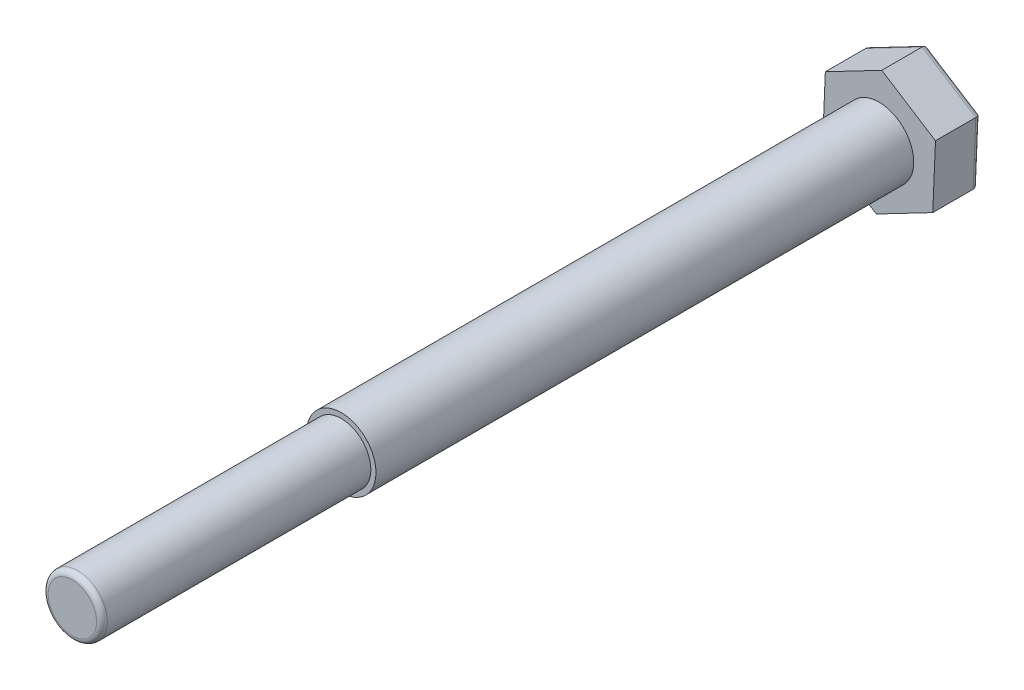
ISO-10303-21;
HEADER;
FILE_DESCRIPTION(('STEP AP214'),'2;1');
FILE_NAME('part.step','',(''),(''),'','','');
FILE_SCHEMA(('AUTOMOTIVE_DESIGN { 1 0 10303 214 1 1 1 1 }'));
ENDSEC;
DATA;
#1=APPLICATION_CONTEXT('core data for automotive mechanical design processes');
#2=APPLICATION_PROTOCOL_DEFINITION('international standard','automotive_design',2000,#1);
#3=PRODUCT_CONTEXT('',#1,'mechanical');
#4=PRODUCT('Part','Part','',(#3));
#5=PRODUCT_RELATED_PRODUCT_CATEGORY('part','',(#4));
#6=PRODUCT_DEFINITION_FORMATION('','',#4);
#7=PRODUCT_DEFINITION_CONTEXT('part definition',#1,'design');
#8=PRODUCT_DEFINITION('design','',#6,#7);
#9=PRODUCT_DEFINITION_SHAPE('','',#8);
#10=(LENGTH_UNIT() NAMED_UNIT(*) SI_UNIT(.MILLI.,.METRE.));
#11=(NAMED_UNIT(*) PLANE_ANGLE_UNIT() SI_UNIT($,.RADIAN.));
#12=(NAMED_UNIT(*) SI_UNIT($,.STERADIAN.) SOLID_ANGLE_UNIT());
#13=UNCERTAINTY_MEASURE_WITH_UNIT(LENGTH_MEASURE(1.E-05),#10,'distance_accuracy_value','');
#14=(GEOMETRIC_REPRESENTATION_CONTEXT(3) GLOBAL_UNCERTAINTY_ASSIGNED_CONTEXT((#13)) GLOBAL_UNIT_ASSIGNED_CONTEXT((#10,
#11,#12)) REPRESENTATION_CONTEXT('',''));
#15=CARTESIAN_POINT('',(0.,0.,0.));
#16=DIRECTION('',(0.,0.,1.));
#17=DIRECTION('',(1.,0.,0.));
#18=AXIS2_PLACEMENT_3D('',#15,#16,#17);
#19=CARTESIAN_POINT('',(19.9787997617734,-12.6957037383635,17.));
#20=DIRECTION('',(-0.999097599975706,0.0424733530909036,0.));
#21=DIRECTION('',(-0.0424733530909036,-0.999097599975706,0.));
#22=AXIS2_PLACEMENT_3D('',#19,#20,#21);
#23=PLANE('',#22);
#24=DIRECTION('',(0.,0.,-1.));
#25=VECTOR('',#24,1.);
#26=CARTESIAN_POINT('',(19.9787997617734,-12.6957037383635,17.));
#27=LINE('',#26,#25);
#28=CARTESIAN_POINT('',(19.9787997617734,-12.6957037383635,17.));
#29=VERTEX_POINT('',#28);
#30=CARTESIAN_POINT('',(19.9787997617734,-12.6957037383635,2.));
#31=VERTEX_POINT('',#30);
#32=EDGE_CURVE('E256',#29,#31,#27,.T.);
#33=ORIENTED_EDGE('',*,*,#32,.T.);
#34=DIRECTION('',(0.0424733530909036,0.999097599975706,0.));
#35=VECTOR('',#34,1.);
#36=CARTESIAN_POINT('',(20.9842018372306,10.9542962616365,2.));
#37=LINE('',#36,#35);
#38=CARTESIAN_POINT('',(20.9842018372306,10.9542962616365,2.));
#39=VERTEX_POINT('',#38);
#40=EDGE_CURVE('E131',#31,#39,#37,.T.);
#41=ORIENTED_EDGE('',*,*,#40,.T.);
#42=DIRECTION('',(0.,0.,-1.));
#43=VECTOR('',#42,1.);
#44=CARTESIAN_POINT('',(20.9842018372306,10.9542962616365,17.));
#45=LINE('',#44,#43);
#46=CARTESIAN_POINT('',(20.9842018372306,10.9542962616365,17.));
#47=VERTEX_POINT('',#46);
#48=EDGE_CURVE('E114',#47,#39,#45,.T.);
#49=ORIENTED_EDGE('',*,*,#48,.F.);
#50=DIRECTION('',(0.0424733530909036,0.999097599975706,0.));
#51=VECTOR('',#50,1.);
#52=CARTESIAN_POINT('',(19.9787997617734,-12.6957037383635,17.));
#53=LINE('',#52,#51);
#54=EDGE_CURVE('E121',#29,#47,#53,.T.);
#55=ORIENTED_EDGE('',*,*,#54,.F.);
#56=EDGE_LOOP('',(#33,#41,#49,#55));
#57=FACE_BOUND('',#56,.T.);
#58=ADVANCED_FACE('F35',(#57),#23,.F.);
#59=CARTESIAN_POINT('',(20.9842018372306,10.9542962616365,17.));
#60=DIRECTION('',(-0.536331802748482,-0.844007225893572,0.));
#61=DIRECTION('',(0.844007225893572,-0.536331802748482,0.));
#62=AXIS2_PLACEMENT_3D('',#59,#60,#61);
#63=PLANE('',#62);
#64=ORIENTED_EDGE('',*,*,#48,.T.);
#65=DIRECTION('',(-0.844007225893572,0.536331802748482,0.));
#66=VECTOR('',#65,1.);
#67=CARTESIAN_POINT('',(1.00540207545719,23.65,2.));
#68=LINE('',#67,#66);
#69=CARTESIAN_POINT('',(1.0054020754572,23.65,2.));
#70=VERTEX_POINT('',#69);
#71=EDGE_CURVE('E135',#39,#70,#68,.T.);
#72=ORIENTED_EDGE('',*,*,#71,.T.);
#73=DIRECTION('',(0.,0.,-1.));
#74=VECTOR('',#73,1.);
#75=CARTESIAN_POINT('',(1.0054020754572,23.65,17.));
#76=LINE('',#75,#74);
#77=CARTESIAN_POINT('',(1.0054020754572,23.65,17.));
#78=VERTEX_POINT('',#77);
#79=EDGE_CURVE('E117',#78,#70,#76,.T.);
#80=ORIENTED_EDGE('',*,*,#79,.F.);
#81=DIRECTION('',(-0.844007225893572,0.536331802748482,0.));
#82=VECTOR('',#81,1.);
#83=CARTESIAN_POINT('',(20.9842018372306,10.9542962616365,17.));
#84=LINE('',#83,#82);
#85=EDGE_CURVE('E109',#47,#78,#84,.T.);
#86=ORIENTED_EDGE('',*,*,#85,.F.);
#87=EDGE_LOOP('',(#64,#72,#80,#86));
#88=FACE_BOUND('',#87,.T.);
#89=ADVANCED_FACE('F111',(#88),#63,.F.);
#90=CARTESIAN_POINT('',(1.0054020754572,23.65,17.));
#91=DIRECTION('',(0.462765797227231,-0.886480578984472,0.));
#92=DIRECTION('',(0.886480578984472,0.462765797227231,0.));
#93=AXIS2_PLACEMENT_3D('',#90,#91,#92);
#94=PLANE('',#93);
#95=ORIENTED_EDGE('',*,*,#79,.T.);
#96=DIRECTION('',(-0.886480578984472,-0.462765797227231,0.));
#97=VECTOR('',#96,1.);
#98=CARTESIAN_POINT('',(-19.9787997617736,12.6957037383632,2.));
#99=LINE('',#98,#97);
#100=CARTESIAN_POINT('',(-19.9787997617736,12.6957037383632,2.));
#101=VERTEX_POINT('',#100);
#102=EDGE_CURVE('E155',#70,#101,#99,.T.);
#103=ORIENTED_EDGE('',*,*,#102,.T.);
#104=DIRECTION('',(0.,0.,-1.));
#105=VECTOR('',#104,1.);
#106=CARTESIAN_POINT('',(-19.9787997617736,12.6957037383632,17.));
#107=LINE('',#106,#105);
#108=CARTESIAN_POINT('',(-19.9787997617736,12.6957037383632,17.));
#109=VERTEX_POINT('',#108);
#110=EDGE_CURVE('E137',#109,#101,#107,.T.);
#111=ORIENTED_EDGE('',*,*,#110,.F.);
#112=DIRECTION('',(-0.886480578984472,-0.462765797227231,0.));
#113=VECTOR('',#112,1.);
#114=CARTESIAN_POINT('',(1.0054020754572,23.65,17.));
#115=LINE('',#114,#113);
#116=EDGE_CURVE('E120',#78,#109,#115,.T.);
#117=ORIENTED_EDGE('',*,*,#116,.F.);
#118=EDGE_LOOP('',(#95,#103,#111,#117));
#119=FACE_BOUND('',#118,.T.);
#120=ADVANCED_FACE('F196',(#119),#94,.F.);
#121=CARTESIAN_POINT('',(-19.9787997617736,12.6957037383632,17.));
#122=DIRECTION('',(0.999097599975706,-0.0424733530908878,0.));
#123=DIRECTION('',(0.0424733530908878,0.999097599975707,0.));
#124=AXIS2_PLACEMENT_3D('',#121,#122,#123);
#125=PLANE('',#124);
#126=ORIENTED_EDGE('',*,*,#110,.T.);
#127=DIRECTION('',(-0.0424733530908878,-0.999097599975707,0.));
#128=VECTOR('',#127,1.);
#129=CARTESIAN_POINT('',(-20.9842018372304,-10.9542962616368,2.));
#130=LINE('',#129,#128);
#131=CARTESIAN_POINT('',(-20.9842018372304,-10.9542962616368,2.));
#132=VERTEX_POINT('',#131);
#133=EDGE_CURVE('E157',#101,#132,#130,.T.);
#134=ORIENTED_EDGE('',*,*,#133,.T.);
#135=DIRECTION('',(0.,0.,-1.));
#136=VECTOR('',#135,1.);
#137=CARTESIAN_POINT('',(-20.9842018372304,-10.9542962616368,17.));
#138=LINE('',#137,#136);
#139=CARTESIAN_POINT('',(-20.9842018372304,-10.9542962616368,17.));
#140=VERTEX_POINT('',#139);
#141=EDGE_CURVE('E260',#140,#132,#138,.T.);
#142=ORIENTED_EDGE('',*,*,#141,.F.);
#143=DIRECTION('',(-0.0424733530908878,-0.999097599975706,0.));
#144=VECTOR('',#143,1.);
#145=CARTESIAN_POINT('',(-19.9787997617736,12.6957037383632,17.));
#146=LINE('',#145,#144);
#147=EDGE_CURVE('E249',#109,#140,#146,.T.);
#148=ORIENTED_EDGE('',*,*,#147,.F.);
#149=EDGE_LOOP('',(#126,#134,#142,#148));
#150=FACE_BOUND('',#149,.T.);
#151=ADVANCED_FACE('F262',(#150),#125,.F.);
#152=CARTESIAN_POINT('',(-20.9842018372304,-10.9542962616368,17.));
#153=DIRECTION('',(0.536331802748476,0.844007225893576,0.));
#154=DIRECTION('',(-0.844007225893576,0.536331802748476,0.));
#155=AXIS2_PLACEMENT_3D('',#152,#153,#154);
#156=PLANE('',#155);
#157=ORIENTED_EDGE('',*,*,#141,.T.);
#158=DIRECTION('',(0.844007225893576,-0.536331802748476,0.));
#159=VECTOR('',#158,1.);
#160=CARTESIAN_POINT('',(-1.00540207545719,-23.65,2.));
#161=LINE('',#160,#159);
#162=CARTESIAN_POINT('',(-1.00540207545719,-23.65,2.));
#163=VERTEX_POINT('',#162);
#164=EDGE_CURVE('E58',#132,#163,#161,.T.);
#165=ORIENTED_EDGE('',*,*,#164,.T.);
#166=DIRECTION('',(0.,0.,-1.));
#167=VECTOR('',#166,1.);
#168=CARTESIAN_POINT('',(-1.00540207545719,-23.65,17.));
#169=LINE('',#168,#167);
#170=CARTESIAN_POINT('',(-1.00540207545719,-23.65,17.));
#171=VERTEX_POINT('',#170);
#172=EDGE_CURVE('E258',#171,#163,#169,.T.);
#173=ORIENTED_EDGE('',*,*,#172,.F.);
#174=DIRECTION('',(0.844007225893576,-0.536331802748476,0.));
#175=VECTOR('',#174,1.);
#176=CARTESIAN_POINT('',(-20.9842018372304,-10.9542962616368,17.));
#177=LINE('',#176,#175);
#178=EDGE_CURVE('E251',#140,#171,#177,.T.);
#179=ORIENTED_EDGE('',*,*,#178,.F.);
#180=EDGE_LOOP('',(#157,#165,#173,#179));
#181=FACE_BOUND('',#180,.T.);
#182=ADVANCED_FACE('F265',(#181),#156,.F.);
#183=CARTESIAN_POINT('',(-1.00540207545719,-23.65,17.));
#184=DIRECTION('',(-0.462765797227224,0.886480578984476,0.));
#185=DIRECTION('',(-0.886480578984476,-0.462765797227224,0.));
#186=AXIS2_PLACEMENT_3D('',#183,#184,#185);
#187=PLANE('',#186);
#188=ORIENTED_EDGE('',*,*,#172,.T.);
#189=DIRECTION('',(0.886480578984476,0.462765797227224,0.));
#190=VECTOR('',#189,1.);
#191=CARTESIAN_POINT('',(19.9787997617734,-12.6957037383635,2.));
#192=LINE('',#191,#190);
#193=EDGE_CURVE('E50',#163,#31,#192,.T.);
#194=ORIENTED_EDGE('',*,*,#193,.T.);
#195=ORIENTED_EDGE('',*,*,#32,.F.);
#196=DIRECTION('',(0.886480578984476,0.462765797227224,0.));
#197=VECTOR('',#196,1.);
#198=CARTESIAN_POINT('',(-1.00540207545719,-23.65,17.));
#199=LINE('',#198,#197);
#200=EDGE_CURVE('E126',#171,#29,#199,.T.);
#201=ORIENTED_EDGE('',*,*,#200,.F.);
#202=EDGE_LOOP('',(#188,#194,#195,#201));
#203=FACE_BOUND('',#202,.T.);
#204=ADVANCED_FACE('F266',(#203),#187,.F.);
#205=CARTESIAN_POINT('',(18.9733976863162,-36.3457037383633,17.));
#206=DIRECTION('',(0.,0.,-1.));
#207=DIRECTION('',(-1.,0.,0.));
#208=AXIS2_PLACEMENT_3D('',#205,#206,#207);
#209=PLANE('',#208);
#210=CARTESIAN_POINT('',(0.,0.,17.));
#211=DIRECTION('',(0.,0.,-1.));
#212=DIRECTION('',(-1.,0.,0.));
#213=AXIS2_PLACEMENT_3D('',#210,#211,#212);
#214=CIRCLE('',#213,12.9);
#215=CARTESIAN_POINT('',(-12.9,0.,17.));
#216=VERTEX_POINT('',#215);
#217=EDGE_CURVE('E132',#216,#216,#214,.F.);
#218=ORIENTED_EDGE('',*,*,#217,.F.);
#219=EDGE_LOOP('',(#218));
#220=FACE_BOUND('',#219,.T.);
#221=ORIENTED_EDGE('',*,*,#54,.T.);
#222=ORIENTED_EDGE('',*,*,#85,.T.);
#223=ORIENTED_EDGE('',*,*,#116,.T.);
#224=ORIENTED_EDGE('',*,*,#147,.T.);
#225=ORIENTED_EDGE('',*,*,#178,.T.);
#226=ORIENTED_EDGE('',*,*,#200,.T.);
#227=EDGE_LOOP('',(#221,#222,#223,#224,#225,#226));
#228=FACE_BOUND('',#227,.T.);
#229=ADVANCED_FACE('F124',(#220,#228),#209,.F.);
#230=CARTESIAN_POINT('',(18.9733976863162,-36.3457037383633,0.));
#231=DIRECTION('',(0.,0.,-1.));
#232=DIRECTION('',(-1.,0.,0.));
#233=AXIS2_PLACEMENT_3D('',#230,#231,#232);
#234=PLANE('',#233);
#235=DIRECTION('',(-0.886480578984472,-0.462765797227231,0.));
#236=VECTOR('',#235,1.);
#237=CARTESIAN_POINT('',(1.93093366991166,21.8770388420311,0.));
#238=LINE('',#237,#236);
#239=CARTESIAN_POINT('',(-18.029648565503,11.4570984955961,0.));
#240=VERTEX_POINT('',#239);
#241=CARTESIAN_POINT('',(0.907314068095531,21.3426829268293,0.));
#242=VERTEX_POINT('',#241);
#243=EDGE_CURVE('E150',#240,#242,#238,.F.);
#244=ORIENTED_EDGE('',*,*,#243,.T.);
#245=DIRECTION('',(-0.844007225893572,0.536331802748482,0.));
#246=VECTOR('',#245,1.);
#247=CARTESIAN_POINT('',(19.9115382317336,9.26628180984933,0.));
#248=LINE('',#247,#246);
#249=CARTESIAN_POINT('',(18.9369626335983,9.88558443123292,0.));
#250=VERTEX_POINT('',#249);
#251=EDGE_CURVE('E152',#242,#250,#248,.F.);
#252=ORIENTED_EDGE('',*,*,#251,.T.);
#253=DIRECTION('',(0.0424733530909036,0.999097599975706,0.));
#254=VECTOR('',#253,1.);
#255=CARTESIAN_POINT('',(17.980604561822,-12.6107570321817,0.));
#256=LINE('',#255,#254);
#257=CARTESIAN_POINT('',(18.0296485655028,-11.4570984955964,0.));
#258=VERTEX_POINT('',#257);
#259=EDGE_CURVE('E142',#250,#258,#256,.F.);
#260=ORIENTED_EDGE('',*,*,#259,.T.);
#261=DIRECTION('',(0.886480578984476,0.462765797227224,0.));
#262=VECTOR('',#261,1.);
#263=CARTESIAN_POINT('',(-1.93093366991164,-21.877038842031,0.));
#264=LINE('',#263,#262);
#265=CARTESIAN_POINT('',(-0.90731406809552,-21.3426829268293,0.));
#266=VERTEX_POINT('',#265);
#267=EDGE_CURVE('E144',#258,#266,#264,.F.);
#268=ORIENTED_EDGE('',*,*,#267,.T.);
#269=DIRECTION('',(0.844007225893576,-0.536331802748476,0.));
#270=VECTOR('',#269,1.);
#271=CARTESIAN_POINT('',(-19.9115382317334,-9.26628180984964,0.));
#272=LINE('',#271,#270);
#273=CARTESIAN_POINT('',(-18.9369626335981,-9.88558443123322,0.));
#274=VERTEX_POINT('',#273);
#275=EDGE_CURVE('E146',#266,#274,#272,.F.);
#276=ORIENTED_EDGE('',*,*,#275,.T.);
#277=DIRECTION('',(-0.0424733530908878,-0.999097599975707,0.));
#278=VECTOR('',#277,1.);
#279=CARTESIAN_POINT('',(-17.9806045618221,12.6107570321814,0.));
#280=LINE('',#279,#278);
#281=EDGE_CURVE('E148',#274,#240,#280,.F.);
#282=ORIENTED_EDGE('',*,*,#281,.T.);
#283=EDGE_LOOP('',(#244,#252,#260,#268,#276,#282));
#284=FACE_BOUND('',#283,.T.);
#285=ADVANCED_FACE('F237',(#284),#234,.T.);
#286=CARTESIAN_POINT('',(0.,0.,217.));
#287=DIRECTION('',(0.,0.,-1.));
#288=DIRECTION('',(-1.,0.,0.));
#289=AXIS2_PLACEMENT_3D('',#286,#287,#288);
#290=CYLINDRICAL_SURFACE('',#289,12.9);
#291=CARTESIAN_POINT('',(0.,0.,217.));
#292=DIRECTION('',(0.,0.,1.));
#293=DIRECTION('',(1.,0.,0.));
#294=AXIS2_PLACEMENT_3D('',#291,#292,#293);
#295=CIRCLE('',#294,12.9);
#296=CARTESIAN_POINT('',(12.9,0.,217.));
#297=VERTEX_POINT('',#296);
#298=EDGE_CURVE('E128',#297,#297,#295,.T.);
#299=ORIENTED_EDGE('',*,*,#298,.F.);
#300=EDGE_LOOP('',(#299));
#301=FACE_BOUND('',#300,.T.);
#302=ORIENTED_EDGE('',*,*,#217,.T.);
#303=EDGE_LOOP('',(#302));
#304=FACE_BOUND('',#303,.T.);
#305=ADVANCED_FACE('F226',(#301,#304),#290,.T.);
#306=CARTESIAN_POINT('',(0.,0.,217.));
#307=DIRECTION('',(0.,0.,1.));
#308=DIRECTION('',(1.,0.,0.));
#309=AXIS2_PLACEMENT_3D('',#306,#307,#308);
#310=PLANE('',#309);
#311=CARTESIAN_POINT('',(0.,0.,217.));
#312=DIRECTION('',(0.,0.,1.));
#313=DIRECTION('',(1.,0.,0.));
#314=AXIS2_PLACEMENT_3D('',#311,#312,#313);
#315=CIRCLE('',#314,11.);
#316=CARTESIAN_POINT('',(11.,0.,217.));
#317=VERTEX_POINT('',#316);
#318=EDGE_CURVE('E165',#317,#317,#315,.T.);
#319=ORIENTED_EDGE('',*,*,#318,.F.);
#320=EDGE_LOOP('',(#319));
#321=FACE_BOUND('',#320,.T.);
#322=ORIENTED_EDGE('',*,*,#298,.T.);
#323=EDGE_LOOP('',(#322));
#324=FACE_BOUND('',#323,.T.);
#325=ADVANCED_FACE('F221',(#321,#324),#310,.T.);
#326=CARTESIAN_POINT('',(-19.9115382317334,-9.26628180984964,2.));
#327=DIRECTION('',(-0.844007225893576,0.536331802748476,0.));
#328=DIRECTION('',(-0.536331802748476,-0.844007225893576,0.));
#329=AXIS2_PLACEMENT_3D('',#326,#327,#328);
#330=CYLINDRICAL_SURFACE('',#329,2.);
#331=CARTESIAN_POINT('',(-18.9369626335981,-9.88558443123322,2.));
#332=DIRECTION('',(-0.462765797227234,0.886480578984471,0.));
#333=DIRECTION('',(-0.886480578984471,-0.462765797227234,0.));
#334=AXIS2_PLACEMENT_3D('',#331,#332,#333);
#335=ELLIPSE('',#334,2.3094010767585,2.);
#336=EDGE_CURVE('E173',#274,#132,#335,.T.);
#337=ORIENTED_EDGE('',*,*,#336,.F.);
#338=ORIENTED_EDGE('',*,*,#275,.F.);
#339=CARTESIAN_POINT('',(-0.90731406809552,-21.3426829268293,2.));
#340=DIRECTION('',(-0.999097599975706,0.0424733530909003,0.));
#341=DIRECTION('',(-0.0424733530909002,-0.999097599975706,0.));
#342=AXIS2_PLACEMENT_3D('',#339,#340,#341);
#343=ELLIPSE('',#342,2.3094010767585,2.);
#344=EDGE_CURVE('E176',#163,#266,#343,.F.);
#345=ORIENTED_EDGE('',*,*,#344,.F.);
#346=ORIENTED_EDGE('',*,*,#164,.F.);
#347=EDGE_LOOP('',(#337,#338,#345,#346));
#348=FACE_BOUND('',#347,.T.);
#349=ADVANCED_FACE('F218',(#348),#330,.T.);
#350=CARTESIAN_POINT('',(-1.93093366991164,-21.877038842031,2.));
#351=DIRECTION('',(-0.886480578984476,-0.462765797227224,0.));
#352=DIRECTION('',(0.462765797227224,-0.886480578984476,0.));
#353=AXIS2_PLACEMENT_3D('',#350,#351,#352);
#354=CYLINDRICAL_SURFACE('',#353,2.);
#355=ORIENTED_EDGE('',*,*,#344,.T.);
#356=ORIENTED_EDGE('',*,*,#267,.F.);
#357=CARTESIAN_POINT('',(18.0296485655028,-11.4570984955964,2.));
#358=DIRECTION('',(-0.536331802748482,-0.844007225893572,0.));
#359=DIRECTION('',(0.844007225893572,-0.536331802748482,0.));
#360=AXIS2_PLACEMENT_3D('',#357,#358,#359);
#361=ELLIPSE('',#360,2.3094010767585,2.);
#362=EDGE_CURVE('E170',#31,#258,#361,.F.);
#363=ORIENTED_EDGE('',*,*,#362,.F.);
#364=ORIENTED_EDGE('',*,*,#193,.F.);
#365=EDGE_LOOP('',(#355,#356,#363,#364));
#366=FACE_BOUND('',#365,.T.);
#367=ADVANCED_FACE('F215',(#366),#354,.T.);
#368=CARTESIAN_POINT('',(-17.9806045618221,12.6107570321814,2.));
#369=DIRECTION('',(0.0424733530908878,0.999097599975707,0.));
#370=DIRECTION('',(-0.999097599975707,0.0424733530908878,0.));
#371=AXIS2_PLACEMENT_3D('',#368,#369,#370);
#372=CYLINDRICAL_SURFACE('',#371,2.);
#373=ORIENTED_EDGE('',*,*,#336,.T.);
#374=ORIENTED_EDGE('',*,*,#133,.F.);
#375=CARTESIAN_POINT('',(-18.029648565503,11.457098495596,2.));
#376=DIRECTION('',(0.536331802748472,0.844007225893579,0.));
#377=DIRECTION('',(-0.844007225893579,0.536331802748472,0.));
#378=AXIS2_PLACEMENT_3D('',#375,#376,#377);
#379=ELLIPSE('',#378,2.30940107675851,2.);
#380=EDGE_CURVE('E167',#240,#101,#379,.T.);
#381=ORIENTED_EDGE('',*,*,#380,.F.);
#382=ORIENTED_EDGE('',*,*,#281,.F.);
#383=EDGE_LOOP('',(#373,#374,#381,#382));
#384=FACE_BOUND('',#383,.T.);
#385=ADVANCED_FACE('F211',(#384),#372,.T.);
#386=CARTESIAN_POINT('',(17.980604561822,-12.6107570321817,2.));
#387=DIRECTION('',(-0.0424733530909036,-0.999097599975706,0.));
#388=DIRECTION('',(0.999097599975706,-0.0424733530909036,0.));
#389=AXIS2_PLACEMENT_3D('',#386,#387,#388);
#390=CYLINDRICAL_SURFACE('',#389,2.);
#391=ORIENTED_EDGE('',*,*,#362,.T.);
#392=ORIENTED_EDGE('',*,*,#259,.F.);
#393=CARTESIAN_POINT('',(18.9369626335983,9.88558443123291,2.));
#394=DIRECTION('',(0.462765797227224,-0.886480578984476,0.));
#395=DIRECTION('',(-0.886480578984476,-0.462765797227224,0.));
#396=AXIS2_PLACEMENT_3D('',#393,#394,#395);
#397=ELLIPSE('',#396,2.3094010767585,2.);
#398=EDGE_CURVE('E164',#39,#250,#397,.F.);
#399=ORIENTED_EDGE('',*,*,#398,.F.);
#400=ORIENTED_EDGE('',*,*,#40,.F.);
#401=EDGE_LOOP('',(#391,#392,#399,#400));
#402=FACE_BOUND('',#401,.T.);
#403=ADVANCED_FACE('F207',(#402),#390,.T.);
#404=CARTESIAN_POINT('',(1.93093366991166,21.8770388420311,2.));
#405=DIRECTION('',(0.886480578984472,0.462765797227231,0.));
#406=DIRECTION('',(-0.462765797227231,0.886480578984472,0.));
#407=AXIS2_PLACEMENT_3D('',#404,#405,#406);
#408=CYLINDRICAL_SURFACE('',#407,2.);
#409=ORIENTED_EDGE('',*,*,#380,.T.);
#410=ORIENTED_EDGE('',*,*,#102,.F.);
#411=CARTESIAN_POINT('',(0.907314068095525,21.3426829268293,2.));
#412=DIRECTION('',(0.999097599975706,-0.0424733530908997,0.));
#413=DIRECTION('',(0.0424733530908995,0.999097599975706,0.));
#414=AXIS2_PLACEMENT_3D('',#411,#412,#413);
#415=ELLIPSE('',#414,2.30940107675851,2.);
#416=EDGE_CURVE('E162',#242,#70,#415,.T.);
#417=ORIENTED_EDGE('',*,*,#416,.F.);
#418=ORIENTED_EDGE('',*,*,#243,.F.);
#419=EDGE_LOOP('',(#409,#410,#417,#418));
#420=FACE_BOUND('',#419,.T.);
#421=ADVANCED_FACE('F203',(#420),#408,.T.);
#422=CARTESIAN_POINT('',(19.9115382317336,9.26628180984933,2.));
#423=DIRECTION('',(0.844007225893572,-0.536331802748482,0.));
#424=DIRECTION('',(0.536331802748482,0.844007225893572,0.));
#425=AXIS2_PLACEMENT_3D('',#422,#423,#424);
#426=CYLINDRICAL_SURFACE('',#425,2.);
#427=ORIENTED_EDGE('',*,*,#398,.T.);
#428=ORIENTED_EDGE('',*,*,#251,.F.);
#429=ORIENTED_EDGE('',*,*,#416,.T.);
#430=ORIENTED_EDGE('',*,*,#71,.F.);
#431=EDGE_LOOP('',(#427,#428,#429,#430));
#432=FACE_BOUND('',#431,.T.);
#433=ADVANCED_FACE('F200',(#432),#426,.T.);
#434=CARTESIAN_POINT('',(0.,0.,317.));
#435=DIRECTION('',(0.,0.,-1.));
#436=DIRECTION('',(-1.,0.,0.));
#437=AXIS2_PLACEMENT_3D('',#434,#435,#436);
#438=CYLINDRICAL_SURFACE('',#437,11.);
#439=CARTESIAN_POINT('',(0.,0.,315.));
#440=DIRECTION('',(0.,0.,1.));
#441=DIRECTION('',(1.,0.,0.));
#442=AXIS2_PLACEMENT_3D('',#439,#440,#441);
#443=CIRCLE('',#442,11.);
#444=CARTESIAN_POINT('',(11.,0.,315.));
#445=VERTEX_POINT('',#444);
#446=EDGE_CURVE('E11',#445,#445,#443,.F.);
#447=ORIENTED_EDGE('',*,*,#446,.T.);
#448=EDGE_LOOP('',(#447));
#449=FACE_BOUND('',#448,.T.);
#450=ORIENTED_EDGE('',*,*,#318,.T.);
#451=EDGE_LOOP('',(#450));
#452=FACE_BOUND('',#451,.T.);
#453=ADVANCED_FACE('F188',(#449,#452),#438,.T.);
#454=CARTESIAN_POINT('',(0.,0.,317.));
#455=DIRECTION('',(0.,0.,1.));
#456=DIRECTION('',(1.,0.,0.));
#457=AXIS2_PLACEMENT_3D('',#454,#455,#456);
#458=PLANE('',#457);
#459=CARTESIAN_POINT('',(0.,0.,317.));
#460=DIRECTION('',(0.,0.,1.));
#461=DIRECTION('',(1.,0.,0.));
#462=AXIS2_PLACEMENT_3D('',#459,#460,#461);
#463=CIRCLE('',#462,9.);
#464=CARTESIAN_POINT('',(9.,0.,317.));
#465=VERTEX_POINT('',#464);
#466=EDGE_CURVE('E43',#465,#465,#463,.T.);
#467=ORIENTED_EDGE('',*,*,#466,.T.);
#468=EDGE_LOOP('',(#467));
#469=FACE_BOUND('',#468,.T.);
#470=ADVANCED_FACE('F181',(#469),#458,.T.);
#471=CARTESIAN_POINT('',(0.,0.,315.));
#472=DIRECTION('',(0.,0.,1.));
#473=DIRECTION('',(1.,0.,0.));
#474=AXIS2_PLACEMENT_3D('',#471,#472,#473);
#475=TOROIDAL_SURFACE('',#474,9.,2.);
#476=ORIENTED_EDGE('',*,*,#446,.F.);
#477=EDGE_LOOP('',(#476));
#478=FACE_BOUND('',#477,.T.);
#479=ORIENTED_EDGE('',*,*,#466,.F.);
#480=EDGE_LOOP('',(#479));
#481=FACE_BOUND('',#480,.T.);
#482=ADVANCED_FACE('F37',(#478,#481),#475,.T.);
#483=CLOSED_SHELL('',(#58,#89,#120,#151,#182,#204,#229,#285,#305,#325,#349,#367,#385,#403,#421,
#433,#453,#470,#482));
#484=MANIFOLD_SOLID_BREP('B2',#483);
#485=ADVANCED_BREP_SHAPE_REPRESENTATION('',(#18,#484),#14);
#486=SHAPE_DEFINITION_REPRESENTATION(#9,#485);
ENDSEC;
END-ISO-10303-21;
